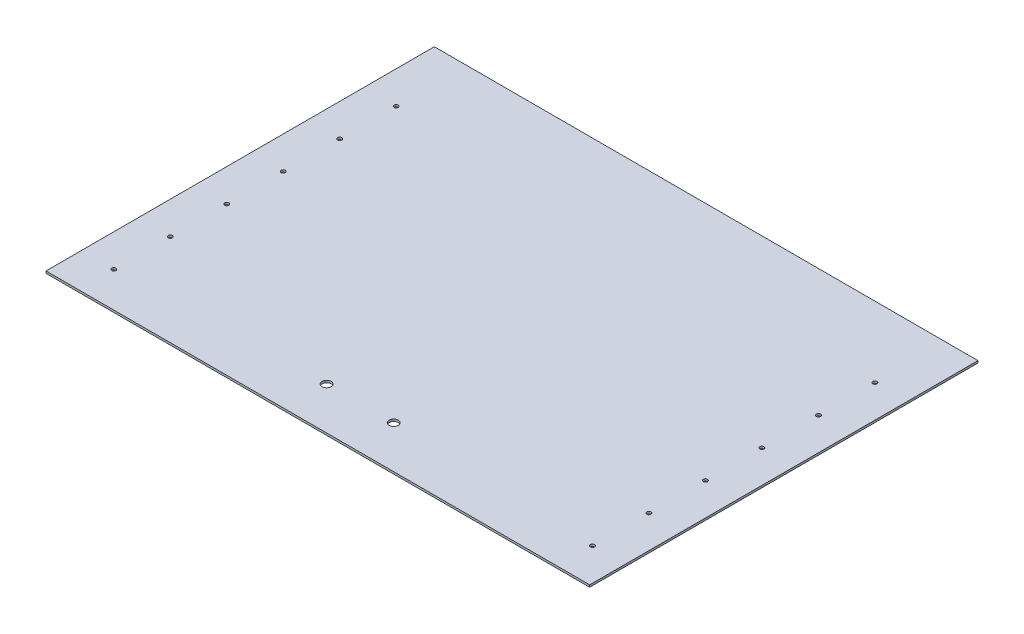
ISO-10303-21;
HEADER;
FILE_DESCRIPTION(('STEP AP214'),'2;1');
FILE_NAME('part.step','',(''),(''),'','','');
FILE_SCHEMA(('AUTOMOTIVE_DESIGN { 1 0 10303 214 1 1 1 1 }'));
ENDSEC;
DATA;
#1=APPLICATION_CONTEXT('core data for automotive mechanical design processes');
#2=APPLICATION_PROTOCOL_DEFINITION('international standard','automotive_design',2000,#1);
#3=PRODUCT_CONTEXT('',#1,'mechanical');
#4=PRODUCT('Part','Part','',(#3));
#5=PRODUCT_RELATED_PRODUCT_CATEGORY('part','',(#4));
#6=PRODUCT_DEFINITION_FORMATION('','',#4);
#7=PRODUCT_DEFINITION_CONTEXT('part definition',#1,'design');
#8=PRODUCT_DEFINITION('design','',#6,#7);
#9=PRODUCT_DEFINITION_SHAPE('','',#8);
#10=(LENGTH_UNIT() NAMED_UNIT(*) SI_UNIT(.MILLI.,.METRE.));
#11=(NAMED_UNIT(*) PLANE_ANGLE_UNIT() SI_UNIT($,.RADIAN.));
#12=(NAMED_UNIT(*) SI_UNIT($,.STERADIAN.) SOLID_ANGLE_UNIT());
#13=UNCERTAINTY_MEASURE_WITH_UNIT(LENGTH_MEASURE(1.E-05),#10,'distance_accuracy_value','');
#14=(GEOMETRIC_REPRESENTATION_CONTEXT(3) GLOBAL_UNCERTAINTY_ASSIGNED_CONTEXT((#13)) GLOBAL_UNIT_ASSIGNED_CONTEXT((#10,
#11,#12)) REPRESENTATION_CONTEXT('',''));
#15=CARTESIAN_POINT('',(0.,0.,0.));
#16=DIRECTION('',(0.,0.,1.));
#17=DIRECTION('',(1.,0.,0.));
#18=AXIS2_PLACEMENT_3D('',#15,#16,#17);
#19=CARTESIAN_POINT('',(385.,-3.,-275.));
#20=DIRECTION('',(1.,0.,0.));
#21=DIRECTION('',(0.,0.,-1.));
#22=AXIS2_PLACEMENT_3D('',#19,#20,#21);
#23=PLANE('',#22);
#24=DIRECTION('',(0.,0.,-1.));
#25=VECTOR('',#24,1.);
#26=CARTESIAN_POINT('',(385.,0.,-275.));
#27=LINE('',#26,#25);
#28=CARTESIAN_POINT('',(385.,0.,275.));
#29=VERTEX_POINT('',#28);
#30=CARTESIAN_POINT('',(385.,0.,-275.));
#31=VERTEX_POINT('',#30);
#32=EDGE_CURVE('E104',#29,#31,#27,.T.);
#33=ORIENTED_EDGE('',*,*,#32,.F.);
#34=DIRECTION('',(0.,1.,0.));
#35=VECTOR('',#34,1.);
#36=CARTESIAN_POINT('',(385.,-3.,275.));
#37=LINE('',#36,#35);
#38=CARTESIAN_POINT('',(385.,-3.,275.));
#39=VERTEX_POINT('',#38);
#40=EDGE_CURVE('E11',#39,#29,#37,.T.);
#41=ORIENTED_EDGE('',*,*,#40,.F.);
#42=DIRECTION('',(0.,0.,-1.));
#43=VECTOR('',#42,1.);
#44=CARTESIAN_POINT('',(385.,-3.,-275.));
#45=LINE('',#44,#43);
#46=CARTESIAN_POINT('',(385.,-3.,-275.));
#47=VERTEX_POINT('',#46);
#48=EDGE_CURVE('E97',#39,#47,#45,.T.);
#49=ORIENTED_EDGE('',*,*,#48,.T.);
#50=DIRECTION('',(0.,1.,0.));
#51=VECTOR('',#50,1.);
#52=CARTESIAN_POINT('',(385.,-3.,-275.));
#53=LINE('',#52,#51);
#54=EDGE_CURVE('E42',#47,#31,#53,.T.);
#55=ORIENTED_EDGE('',*,*,#54,.T.);
#56=EDGE_LOOP('',(#33,#41,#49,#55));
#57=FACE_BOUND('',#56,.T.);
#58=ADVANCED_FACE('F39',(#57),#23,.T.);
#59=CARTESIAN_POINT('',(-385.,-3.,275.));
#60=DIRECTION('',(0.,0.,1.));
#61=DIRECTION('',(1.,0.,0.));
#62=AXIS2_PLACEMENT_3D('',#59,#60,#61);
#63=PLANE('',#62);
#64=DIRECTION('',(1.,0.,0.));
#65=VECTOR('',#64,1.);
#66=CARTESIAN_POINT('',(-385.,0.,275.));
#67=LINE('',#66,#65);
#68=CARTESIAN_POINT('',(-385.,0.,275.));
#69=VERTEX_POINT('',#68);
#70=EDGE_CURVE('E99',#69,#29,#67,.T.);
#71=ORIENTED_EDGE('',*,*,#70,.F.);
#72=DIRECTION('',(0.,1.,0.));
#73=VECTOR('',#72,1.);
#74=CARTESIAN_POINT('',(-385.,-3.,275.));
#75=LINE('',#74,#73);
#76=CARTESIAN_POINT('',(-385.,-3.,275.));
#77=VERTEX_POINT('',#76);
#78=EDGE_CURVE('E48',#77,#69,#75,.T.);
#79=ORIENTED_EDGE('',*,*,#78,.F.);
#80=DIRECTION('',(1.,0.,0.));
#81=VECTOR('',#80,1.);
#82=CARTESIAN_POINT('',(-385.,-3.,275.));
#83=LINE('',#82,#81);
#84=EDGE_CURVE('E94',#77,#39,#83,.T.);
#85=ORIENTED_EDGE('',*,*,#84,.T.);
#86=ORIENTED_EDGE('',*,*,#40,.T.);
#87=EDGE_LOOP('',(#71,#79,#85,#86));
#88=FACE_BOUND('',#87,.T.);
#89=ADVANCED_FACE('F115',(#88),#63,.T.);
#90=CARTESIAN_POINT('',(-385.,-3.,-275.));
#91=DIRECTION('',(-1.,0.,0.));
#92=DIRECTION('',(0.,0.,1.));
#93=AXIS2_PLACEMENT_3D('',#90,#91,#92);
#94=PLANE('',#93);
#95=DIRECTION('',(0.,0.,1.));
#96=VECTOR('',#95,1.);
#97=CARTESIAN_POINT('',(-385.,0.,-275.));
#98=LINE('',#97,#96);
#99=CARTESIAN_POINT('',(-385.,0.,-275.));
#100=VERTEX_POINT('',#99);
#101=EDGE_CURVE('E89',#100,#69,#98,.T.);
#102=ORIENTED_EDGE('',*,*,#101,.F.);
#103=DIRECTION('',(0.,1.,0.));
#104=VECTOR('',#103,1.);
#105=CARTESIAN_POINT('',(-385.,-3.,-275.));
#106=LINE('',#105,#104);
#107=CARTESIAN_POINT('',(-385.,-3.,-275.));
#108=VERTEX_POINT('',#107);
#109=EDGE_CURVE('E84',#108,#100,#106,.T.);
#110=ORIENTED_EDGE('',*,*,#109,.F.);
#111=DIRECTION('',(0.,0.,1.));
#112=VECTOR('',#111,1.);
#113=CARTESIAN_POINT('',(-385.,-3.,-275.));
#114=LINE('',#113,#112);
#115=EDGE_CURVE('E87',#108,#77,#114,.T.);
#116=ORIENTED_EDGE('',*,*,#115,.T.);
#117=ORIENTED_EDGE('',*,*,#78,.T.);
#118=EDGE_LOOP('',(#102,#110,#116,#117));
#119=FACE_BOUND('',#118,.T.);
#120=ADVANCED_FACE('F86',(#119),#94,.T.);
#121=CARTESIAN_POINT('',(-385.,-3.,-275.));
#122=DIRECTION('',(0.,0.,-1.));
#123=DIRECTION('',(-1.,0.,0.));
#124=AXIS2_PLACEMENT_3D('',#121,#122,#123);
#125=PLANE('',#124);
#126=DIRECTION('',(-1.,0.,0.));
#127=VECTOR('',#126,1.);
#128=CARTESIAN_POINT('',(-385.,0.,-275.));
#129=LINE('',#128,#127);
#130=EDGE_CURVE('E107',#31,#100,#129,.T.);
#131=ORIENTED_EDGE('',*,*,#130,.F.);
#132=ORIENTED_EDGE('',*,*,#54,.F.);
#133=DIRECTION('',(-1.,0.,0.));
#134=VECTOR('',#133,1.);
#135=CARTESIAN_POINT('',(-385.,-3.,-275.));
#136=LINE('',#135,#134);
#137=EDGE_CURVE('E93',#47,#108,#136,.T.);
#138=ORIENTED_EDGE('',*,*,#137,.T.);
#139=ORIENTED_EDGE('',*,*,#109,.T.);
#140=EDGE_LOOP('',(#131,#132,#138,#139));
#141=FACE_BOUND('',#140,.T.);
#142=ADVANCED_FACE('F96',(#141),#125,.T.);
#143=CARTESIAN_POINT('',(0.,-3.,0.));
#144=DIRECTION('',(0.,1.,0.));
#145=DIRECTION('',(0.,0.,1.));
#146=AXIS2_PLACEMENT_3D('',#143,#144,#145);
#147=PLANE('',#146);
#148=CARTESIAN_POINT('',(339.,-3.,-175.));
#149=DIRECTION('',(0.,1.,0.));
#150=DIRECTION('',(0.,0.,-1.));
#151=AXIS2_PLACEMENT_3D('',#148,#149,#150);
#152=CIRCLE('',#151,2.99999999999999);
#153=CARTESIAN_POINT('',(339.,-3.,-178.));
#154=VERTEX_POINT('',#153);
#155=EDGE_CURVE('E196',#154,#154,#152,.T.);
#156=ORIENTED_EDGE('',*,*,#155,.T.);
#157=EDGE_LOOP('',(#156));
#158=FACE_BOUND('',#157,.T.);
#159=CARTESIAN_POINT('',(339.,-3.,-95.0000000000002));
#160=DIRECTION('',(0.,1.,0.));
#161=DIRECTION('',(0.,0.,-1.));
#162=AXIS2_PLACEMENT_3D('',#159,#160,#161);
#163=CIRCLE('',#162,2.99999999999999);
#164=CARTESIAN_POINT('',(339.,-3.,-98.0000000000002));
#165=VERTEX_POINT('',#164);
#166=EDGE_CURVE('E204',#165,#165,#163,.T.);
#167=ORIENTED_EDGE('',*,*,#166,.T.);
#168=EDGE_LOOP('',(#167));
#169=FACE_BOUND('',#168,.T.);
#170=CARTESIAN_POINT('',(339.,-3.,-15.0000000000002));
#171=DIRECTION('',(0.,1.,0.));
#172=DIRECTION('',(0.,0.,-1.));
#173=AXIS2_PLACEMENT_3D('',#170,#171,#172);
#174=CIRCLE('',#173,2.99999999999999);
#175=CARTESIAN_POINT('',(339.,-3.,-18.0000000000002));
#176=VERTEX_POINT('',#175);
#177=EDGE_CURVE('E210',#176,#176,#174,.T.);
#178=ORIENTED_EDGE('',*,*,#177,.T.);
#179=EDGE_LOOP('',(#178));
#180=FACE_BOUND('',#179,.T.);
#181=CARTESIAN_POINT('',(339.,-3.,64.9999999999998));
#182=DIRECTION('',(0.,1.,0.));
#183=DIRECTION('',(0.,0.,-1.));
#184=AXIS2_PLACEMENT_3D('',#181,#182,#183);
#185=CIRCLE('',#184,2.99999999999999);
#186=CARTESIAN_POINT('',(339.,-3.,61.9999999999998));
#187=VERTEX_POINT('',#186);
#188=EDGE_CURVE('E216',#187,#187,#185,.T.);
#189=ORIENTED_EDGE('',*,*,#188,.T.);
#190=EDGE_LOOP('',(#189));
#191=FACE_BOUND('',#190,.T.);
#192=CARTESIAN_POINT('',(339.,-3.,145.));
#193=DIRECTION('',(0.,1.,0.));
#194=DIRECTION('',(0.,0.,-1.));
#195=AXIS2_PLACEMENT_3D('',#192,#193,#194);
#196=CIRCLE('',#195,2.99999999999999);
#197=CARTESIAN_POINT('',(339.,-3.,142.));
#198=VERTEX_POINT('',#197);
#199=EDGE_CURVE('E222',#198,#198,#196,.T.);
#200=ORIENTED_EDGE('',*,*,#199,.T.);
#201=EDGE_LOOP('',(#200));
#202=FACE_BOUND('',#201,.T.);
#203=CARTESIAN_POINT('',(339.,-3.,225.));
#204=DIRECTION('',(0.,1.,0.));
#205=DIRECTION('',(0.,0.,-1.));
#206=AXIS2_PLACEMENT_3D('',#203,#204,#205);
#207=CIRCLE('',#206,2.99999999999999);
#208=CARTESIAN_POINT('',(339.,-3.,222.));
#209=VERTEX_POINT('',#208);
#210=EDGE_CURVE('E228',#209,#209,#207,.T.);
#211=ORIENTED_EDGE('',*,*,#210,.T.);
#212=EDGE_LOOP('',(#211));
#213=FACE_BOUND('',#212,.T.);
#214=CARTESIAN_POINT('',(47.5000000000001,-3.,215.));
#215=DIRECTION('',(0.,1.,0.));
#216=DIRECTION('',(0.,0.,-1.));
#217=AXIS2_PLACEMENT_3D('',#214,#215,#216);
#218=CIRCLE('',#217,6.50000000000001);
#219=CARTESIAN_POINT('',(47.5000000000001,-3.,208.5));
#220=VERTEX_POINT('',#219);
#221=EDGE_CURVE('E234',#220,#220,#218,.T.);
#222=ORIENTED_EDGE('',*,*,#221,.T.);
#223=EDGE_LOOP('',(#222));
#224=FACE_BOUND('',#223,.T.);
#225=CARTESIAN_POINT('',(-47.4999999999999,-3.,215.));
#226=DIRECTION('',(0.,1.,0.));
#227=DIRECTION('',(0.,0.,1.));
#228=AXIS2_PLACEMENT_3D('',#225,#226,#227);
#229=CIRCLE('',#228,6.50000000000001);
#230=CARTESIAN_POINT('',(-47.4999999999999,-3.,221.5));
#231=VERTEX_POINT('',#230);
#232=EDGE_CURVE('E240',#231,#231,#229,.T.);
#233=ORIENTED_EDGE('',*,*,#232,.T.);
#234=EDGE_LOOP('',(#233));
#235=FACE_BOUND('',#234,.T.);
#236=CARTESIAN_POINT('',(-339.,-3.,225.));
#237=DIRECTION('',(0.,1.,0.));
#238=DIRECTION('',(0.,0.,1.));
#239=AXIS2_PLACEMENT_3D('',#236,#237,#238);
#240=CIRCLE('',#239,2.99999999999999);
#241=CARTESIAN_POINT('',(-339.,-3.,228.));
#242=VERTEX_POINT('',#241);
#243=EDGE_CURVE('E246',#242,#242,#240,.T.);
#244=ORIENTED_EDGE('',*,*,#243,.T.);
#245=EDGE_LOOP('',(#244));
#246=FACE_BOUND('',#245,.T.);
#247=CARTESIAN_POINT('',(-339.,-3.,145.));
#248=DIRECTION('',(0.,1.,0.));
#249=DIRECTION('',(0.,0.,1.));
#250=AXIS2_PLACEMENT_3D('',#247,#248,#249);
#251=CIRCLE('',#250,2.99999999999999);
#252=CARTESIAN_POINT('',(-339.,-3.,148.));
#253=VERTEX_POINT('',#252);
#254=EDGE_CURVE('E252',#253,#253,#251,.T.);
#255=ORIENTED_EDGE('',*,*,#254,.T.);
#256=EDGE_LOOP('',(#255));
#257=FACE_BOUND('',#256,.T.);
#258=CARTESIAN_POINT('',(-339.,-3.,64.9999999999998));
#259=DIRECTION('',(0.,1.,0.));
#260=DIRECTION('',(0.,0.,1.));
#261=AXIS2_PLACEMENT_3D('',#258,#259,#260);
#262=CIRCLE('',#261,2.99999999999999);
#263=CARTESIAN_POINT('',(-339.,-3.,67.9999999999998));
#264=VERTEX_POINT('',#263);
#265=EDGE_CURVE('E258',#264,#264,#262,.T.);
#266=ORIENTED_EDGE('',*,*,#265,.T.);
#267=EDGE_LOOP('',(#266));
#268=FACE_BOUND('',#267,.T.);
#269=CARTESIAN_POINT('',(-339.,-3.,-15.0000000000002));
#270=DIRECTION('',(0.,1.,0.));
#271=DIRECTION('',(0.,0.,1.));
#272=AXIS2_PLACEMENT_3D('',#269,#270,#271);
#273=CIRCLE('',#272,2.99999999999999);
#274=CARTESIAN_POINT('',(-339.,-3.,-12.0000000000002));
#275=VERTEX_POINT('',#274);
#276=EDGE_CURVE('E264',#275,#275,#273,.T.);
#277=ORIENTED_EDGE('',*,*,#276,.T.);
#278=EDGE_LOOP('',(#277));
#279=FACE_BOUND('',#278,.T.);
#280=CARTESIAN_POINT('',(-339.,-3.,-95.0000000000001));
#281=DIRECTION('',(0.,1.,0.));
#282=DIRECTION('',(0.,0.,1.));
#283=AXIS2_PLACEMENT_3D('',#280,#281,#282);
#284=CIRCLE('',#283,2.99999999999999);
#285=CARTESIAN_POINT('',(-339.,-3.,-92.0000000000002));
#286=VERTEX_POINT('',#285);
#287=EDGE_CURVE('E270',#286,#286,#284,.T.);
#288=ORIENTED_EDGE('',*,*,#287,.T.);
#289=EDGE_LOOP('',(#288));
#290=FACE_BOUND('',#289,.T.);
#291=CARTESIAN_POINT('',(-339.,-3.,-175.));
#292=DIRECTION('',(0.,1.,0.));
#293=DIRECTION('',(0.,0.,1.));
#294=AXIS2_PLACEMENT_3D('',#291,#292,#293);
#295=CIRCLE('',#294,2.99999999999999);
#296=CARTESIAN_POINT('',(-339.,-3.,-172.));
#297=VERTEX_POINT('',#296);
#298=EDGE_CURVE('E108',#297,#297,#295,.T.);
#299=ORIENTED_EDGE('',*,*,#298,.T.);
#300=EDGE_LOOP('',(#299));
#301=FACE_BOUND('',#300,.T.);
#302=ORIENTED_EDGE('',*,*,#48,.F.);
#303=ORIENTED_EDGE('',*,*,#84,.F.);
#304=ORIENTED_EDGE('',*,*,#115,.F.);
#305=ORIENTED_EDGE('',*,*,#137,.F.);
#306=EDGE_LOOP('',(#302,#303,#304,#305));
#307=FACE_BOUND('',#306,.T.);
#308=ADVANCED_FACE('F92',(#158,#169,#180,#191,#202,#213,#224,#235,#246,#257,#268,#279,#290,#301,
#307),#147,.F.);
#309=CARTESIAN_POINT('',(0.,0.,0.));
#310=DIRECTION('',(0.,1.,0.));
#311=DIRECTION('',(0.,0.,1.));
#312=AXIS2_PLACEMENT_3D('',#309,#310,#311);
#313=PLANE('',#312);
#314=CARTESIAN_POINT('',(339.,0.,-175.));
#315=DIRECTION('',(0.,1.,0.));
#316=DIRECTION('',(0.,0.,-1.));
#317=AXIS2_PLACEMENT_3D('',#314,#315,#316);
#318=CIRCLE('',#317,2.99999999999999);
#319=CARTESIAN_POINT('',(339.,0.,-178.));
#320=VERTEX_POINT('',#319);
#321=EDGE_CURVE('E199',#320,#320,#318,.T.);
#322=ORIENTED_EDGE('',*,*,#321,.F.);
#323=EDGE_LOOP('',(#322));
#324=FACE_BOUND('',#323,.T.);
#325=CARTESIAN_POINT('',(339.,0.,-95.0000000000002));
#326=DIRECTION('',(0.,1.,0.));
#327=DIRECTION('',(0.,0.,-1.));
#328=AXIS2_PLACEMENT_3D('',#325,#326,#327);
#329=CIRCLE('',#328,2.99999999999999);
#330=CARTESIAN_POINT('',(339.,0.,-98.0000000000002));
#331=VERTEX_POINT('',#330);
#332=EDGE_CURVE('E201',#331,#331,#329,.T.);
#333=ORIENTED_EDGE('',*,*,#332,.F.);
#334=EDGE_LOOP('',(#333));
#335=FACE_BOUND('',#334,.T.);
#336=CARTESIAN_POINT('',(339.,0.,-15.0000000000002));
#337=DIRECTION('',(0.,1.,0.));
#338=DIRECTION('',(0.,0.,-1.));
#339=AXIS2_PLACEMENT_3D('',#336,#337,#338);
#340=CIRCLE('',#339,2.99999999999999);
#341=CARTESIAN_POINT('',(339.,0.,-18.0000000000002));
#342=VERTEX_POINT('',#341);
#343=EDGE_CURVE('E207',#342,#342,#340,.T.);
#344=ORIENTED_EDGE('',*,*,#343,.F.);
#345=EDGE_LOOP('',(#344));
#346=FACE_BOUND('',#345,.T.);
#347=CARTESIAN_POINT('',(339.,0.,64.9999999999998));
#348=DIRECTION('',(0.,1.,0.));
#349=DIRECTION('',(0.,0.,-1.));
#350=AXIS2_PLACEMENT_3D('',#347,#348,#349);
#351=CIRCLE('',#350,2.99999999999999);
#352=CARTESIAN_POINT('',(339.,0.,61.9999999999998));
#353=VERTEX_POINT('',#352);
#354=EDGE_CURVE('E213',#353,#353,#351,.T.);
#355=ORIENTED_EDGE('',*,*,#354,.F.);
#356=EDGE_LOOP('',(#355));
#357=FACE_BOUND('',#356,.T.);
#358=CARTESIAN_POINT('',(339.,0.,145.));
#359=DIRECTION('',(0.,1.,0.));
#360=DIRECTION('',(0.,0.,-1.));
#361=AXIS2_PLACEMENT_3D('',#358,#359,#360);
#362=CIRCLE('',#361,2.99999999999999);
#363=CARTESIAN_POINT('',(339.,0.,142.));
#364=VERTEX_POINT('',#363);
#365=EDGE_CURVE('E219',#364,#364,#362,.T.);
#366=ORIENTED_EDGE('',*,*,#365,.F.);
#367=EDGE_LOOP('',(#366));
#368=FACE_BOUND('',#367,.T.);
#369=CARTESIAN_POINT('',(339.,0.,225.));
#370=DIRECTION('',(0.,1.,0.));
#371=DIRECTION('',(0.,0.,-1.));
#372=AXIS2_PLACEMENT_3D('',#369,#370,#371);
#373=CIRCLE('',#372,2.99999999999999);
#374=CARTESIAN_POINT('',(339.,0.,222.));
#375=VERTEX_POINT('',#374);
#376=EDGE_CURVE('E225',#375,#375,#373,.T.);
#377=ORIENTED_EDGE('',*,*,#376,.F.);
#378=EDGE_LOOP('',(#377));
#379=FACE_BOUND('',#378,.T.);
#380=CARTESIAN_POINT('',(47.5000000000001,0.,215.));
#381=DIRECTION('',(0.,1.,0.));
#382=DIRECTION('',(0.,0.,-1.));
#383=AXIS2_PLACEMENT_3D('',#380,#381,#382);
#384=CIRCLE('',#383,6.50000000000001);
#385=CARTESIAN_POINT('',(47.5000000000001,0.,208.5));
#386=VERTEX_POINT('',#385);
#387=EDGE_CURVE('E231',#386,#386,#384,.T.);
#388=ORIENTED_EDGE('',*,*,#387,.F.);
#389=EDGE_LOOP('',(#388));
#390=FACE_BOUND('',#389,.T.);
#391=CARTESIAN_POINT('',(-47.4999999999999,0.,215.));
#392=DIRECTION('',(0.,1.,0.));
#393=DIRECTION('',(0.,0.,1.));
#394=AXIS2_PLACEMENT_3D('',#391,#392,#393);
#395=CIRCLE('',#394,6.50000000000001);
#396=CARTESIAN_POINT('',(-47.4999999999999,0.,221.5));
#397=VERTEX_POINT('',#396);
#398=EDGE_CURVE('E237',#397,#397,#395,.T.);
#399=ORIENTED_EDGE('',*,*,#398,.F.);
#400=EDGE_LOOP('',(#399));
#401=FACE_BOUND('',#400,.T.);
#402=CARTESIAN_POINT('',(-339.,0.,225.));
#403=DIRECTION('',(0.,1.,0.));
#404=DIRECTION('',(0.,0.,1.));
#405=AXIS2_PLACEMENT_3D('',#402,#403,#404);
#406=CIRCLE('',#405,2.99999999999999);
#407=CARTESIAN_POINT('',(-339.,0.,228.));
#408=VERTEX_POINT('',#407);
#409=EDGE_CURVE('E243',#408,#408,#406,.T.);
#410=ORIENTED_EDGE('',*,*,#409,.F.);
#411=EDGE_LOOP('',(#410));
#412=FACE_BOUND('',#411,.T.);
#413=CARTESIAN_POINT('',(-339.,0.,145.));
#414=DIRECTION('',(0.,1.,0.));
#415=DIRECTION('',(0.,0.,1.));
#416=AXIS2_PLACEMENT_3D('',#413,#414,#415);
#417=CIRCLE('',#416,2.99999999999999);
#418=CARTESIAN_POINT('',(-339.,0.,148.));
#419=VERTEX_POINT('',#418);
#420=EDGE_CURVE('E249',#419,#419,#417,.T.);
#421=ORIENTED_EDGE('',*,*,#420,.F.);
#422=EDGE_LOOP('',(#421));
#423=FACE_BOUND('',#422,.T.);
#424=CARTESIAN_POINT('',(-339.,0.,64.9999999999998));
#425=DIRECTION('',(0.,1.,0.));
#426=DIRECTION('',(0.,0.,1.));
#427=AXIS2_PLACEMENT_3D('',#424,#425,#426);
#428=CIRCLE('',#427,2.99999999999999);
#429=CARTESIAN_POINT('',(-339.,0.,67.9999999999998));
#430=VERTEX_POINT('',#429);
#431=EDGE_CURVE('E255',#430,#430,#428,.T.);
#432=ORIENTED_EDGE('',*,*,#431,.F.);
#433=EDGE_LOOP('',(#432));
#434=FACE_BOUND('',#433,.T.);
#435=CARTESIAN_POINT('',(-339.,0.,-15.0000000000002));
#436=DIRECTION('',(0.,1.,0.));
#437=DIRECTION('',(0.,0.,1.));
#438=AXIS2_PLACEMENT_3D('',#435,#436,#437);
#439=CIRCLE('',#438,2.99999999999999);
#440=CARTESIAN_POINT('',(-339.,0.,-12.0000000000002));
#441=VERTEX_POINT('',#440);
#442=EDGE_CURVE('E261',#441,#441,#439,.T.);
#443=ORIENTED_EDGE('',*,*,#442,.F.);
#444=EDGE_LOOP('',(#443));
#445=FACE_BOUND('',#444,.T.);
#446=CARTESIAN_POINT('',(-339.,0.,-95.0000000000001));
#447=DIRECTION('',(0.,1.,0.));
#448=DIRECTION('',(0.,0.,1.));
#449=AXIS2_PLACEMENT_3D('',#446,#447,#448);
#450=CIRCLE('',#449,2.99999999999999);
#451=CARTESIAN_POINT('',(-339.,0.,-92.0000000000002));
#452=VERTEX_POINT('',#451);
#453=EDGE_CURVE('E267',#452,#452,#450,.T.);
#454=ORIENTED_EDGE('',*,*,#453,.F.);
#455=EDGE_LOOP('',(#454));
#456=FACE_BOUND('',#455,.T.);
#457=CARTESIAN_POINT('',(-339.,0.,-175.));
#458=DIRECTION('',(0.,1.,0.));
#459=DIRECTION('',(0.,0.,1.));
#460=AXIS2_PLACEMENT_3D('',#457,#458,#459);
#461=CIRCLE('',#460,2.99999999999999);
#462=CARTESIAN_POINT('',(-339.,0.,-172.));
#463=VERTEX_POINT('',#462);
#464=EDGE_CURVE('E273',#463,#463,#461,.T.);
#465=ORIENTED_EDGE('',*,*,#464,.F.);
#466=EDGE_LOOP('',(#465));
#467=FACE_BOUND('',#466,.T.);
#468=ORIENTED_EDGE('',*,*,#32,.T.);
#469=ORIENTED_EDGE('',*,*,#130,.T.);
#470=ORIENTED_EDGE('',*,*,#101,.T.);
#471=ORIENTED_EDGE('',*,*,#70,.T.);
#472=EDGE_LOOP('',(#468,#469,#470,#471));
#473=FACE_BOUND('',#472,.T.);
#474=ADVANCED_FACE('F114',(#324,#335,#346,#357,#368,#379,#390,#401,#412,#423,#434,#445,#456,
#467,#473),#313,.T.);
#475=CARTESIAN_POINT('',(-339.,-3.,-175.));
#476=DIRECTION('',(0.,1.,0.));
#477=DIRECTION('',(0.,0.,1.));
#478=AXIS2_PLACEMENT_3D('',#475,#476,#477);
#479=CYLINDRICAL_SURFACE('',#478,2.99999999999999);
#480=ORIENTED_EDGE('',*,*,#298,.F.);
#481=EDGE_LOOP('',(#480));
#482=FACE_BOUND('',#481,.T.);
#483=ORIENTED_EDGE('',*,*,#464,.T.);
#484=EDGE_LOOP('',(#483));
#485=FACE_BOUND('',#484,.T.);
#486=ADVANCED_FACE('F133',(#482,#485),#479,.F.);
#487=CARTESIAN_POINT('',(-339.,-3.,-95.0000000000001));
#488=DIRECTION('',(0.,1.,0.));
#489=DIRECTION('',(0.,0.,1.));
#490=AXIS2_PLACEMENT_3D('',#487,#488,#489);
#491=CYLINDRICAL_SURFACE('',#490,2.99999999999999);
#492=ORIENTED_EDGE('',*,*,#287,.F.);
#493=EDGE_LOOP('',(#492));
#494=FACE_BOUND('',#493,.T.);
#495=ORIENTED_EDGE('',*,*,#453,.T.);
#496=EDGE_LOOP('',(#495));
#497=FACE_BOUND('',#496,.T.);
#498=ADVANCED_FACE('F140',(#494,#497),#491,.F.);
#499=CARTESIAN_POINT('',(-339.,-3.,-15.0000000000002));
#500=DIRECTION('',(0.,1.,0.));
#501=DIRECTION('',(0.,0.,1.));
#502=AXIS2_PLACEMENT_3D('',#499,#500,#501);
#503=CYLINDRICAL_SURFACE('',#502,2.99999999999999);
#504=ORIENTED_EDGE('',*,*,#276,.F.);
#505=EDGE_LOOP('',(#504));
#506=FACE_BOUND('',#505,.T.);
#507=ORIENTED_EDGE('',*,*,#442,.T.);
#508=EDGE_LOOP('',(#507));
#509=FACE_BOUND('',#508,.T.);
#510=ADVANCED_FACE('F144',(#506,#509),#503,.F.);
#511=CARTESIAN_POINT('',(-339.,-3.,64.9999999999998));
#512=DIRECTION('',(0.,1.,0.));
#513=DIRECTION('',(0.,0.,1.));
#514=AXIS2_PLACEMENT_3D('',#511,#512,#513);
#515=CYLINDRICAL_SURFACE('',#514,2.99999999999999);
#516=ORIENTED_EDGE('',*,*,#265,.F.);
#517=EDGE_LOOP('',(#516));
#518=FACE_BOUND('',#517,.T.);
#519=ORIENTED_EDGE('',*,*,#431,.T.);
#520=EDGE_LOOP('',(#519));
#521=FACE_BOUND('',#520,.T.);
#522=ADVANCED_FACE('F148',(#518,#521),#515,.F.);
#523=CARTESIAN_POINT('',(-339.,-3.,145.));
#524=DIRECTION('',(0.,1.,0.));
#525=DIRECTION('',(0.,0.,1.));
#526=AXIS2_PLACEMENT_3D('',#523,#524,#525);
#527=CYLINDRICAL_SURFACE('',#526,2.99999999999999);
#528=ORIENTED_EDGE('',*,*,#254,.F.);
#529=EDGE_LOOP('',(#528));
#530=FACE_BOUND('',#529,.T.);
#531=ORIENTED_EDGE('',*,*,#420,.T.);
#532=EDGE_LOOP('',(#531));
#533=FACE_BOUND('',#532,.T.);
#534=ADVANCED_FACE('F152',(#530,#533),#527,.F.);
#535=CARTESIAN_POINT('',(-339.,-3.,225.));
#536=DIRECTION('',(0.,1.,0.));
#537=DIRECTION('',(0.,0.,1.));
#538=AXIS2_PLACEMENT_3D('',#535,#536,#537);
#539=CYLINDRICAL_SURFACE('',#538,2.99999999999999);
#540=ORIENTED_EDGE('',*,*,#243,.F.);
#541=EDGE_LOOP('',(#540));
#542=FACE_BOUND('',#541,.T.);
#543=ORIENTED_EDGE('',*,*,#409,.T.);
#544=EDGE_LOOP('',(#543));
#545=FACE_BOUND('',#544,.T.);
#546=ADVANCED_FACE('F156',(#542,#545),#539,.F.);
#547=CARTESIAN_POINT('',(-47.4999999999999,-3.,215.));
#548=DIRECTION('',(0.,1.,0.));
#549=DIRECTION('',(0.,0.,1.));
#550=AXIS2_PLACEMENT_3D('',#547,#548,#549);
#551=CYLINDRICAL_SURFACE('',#550,6.50000000000001);
#552=ORIENTED_EDGE('',*,*,#232,.F.);
#553=EDGE_LOOP('',(#552));
#554=FACE_BOUND('',#553,.T.);
#555=ORIENTED_EDGE('',*,*,#398,.T.);
#556=EDGE_LOOP('',(#555));
#557=FACE_BOUND('',#556,.T.);
#558=ADVANCED_FACE('F160',(#554,#557),#551,.F.);
#559=CARTESIAN_POINT('',(47.5000000000001,-3.,215.));
#560=DIRECTION('',(0.,1.,0.));
#561=DIRECTION('',(0.,0.,1.));
#562=AXIS2_PLACEMENT_3D('',#559,#560,#561);
#563=CYLINDRICAL_SURFACE('',#562,6.50000000000001);
#564=ORIENTED_EDGE('',*,*,#221,.F.);
#565=EDGE_LOOP('',(#564));
#566=FACE_BOUND('',#565,.T.);
#567=ORIENTED_EDGE('',*,*,#387,.T.);
#568=EDGE_LOOP('',(#567));
#569=FACE_BOUND('',#568,.T.);
#570=ADVANCED_FACE('F164',(#566,#569),#563,.F.);
#571=CARTESIAN_POINT('',(339.,-3.,225.));
#572=DIRECTION('',(0.,1.,0.));
#573=DIRECTION('',(0.,0.,1.));
#574=AXIS2_PLACEMENT_3D('',#571,#572,#573);
#575=CYLINDRICAL_SURFACE('',#574,2.99999999999999);
#576=ORIENTED_EDGE('',*,*,#210,.F.);
#577=EDGE_LOOP('',(#576));
#578=FACE_BOUND('',#577,.T.);
#579=ORIENTED_EDGE('',*,*,#376,.T.);
#580=EDGE_LOOP('',(#579));
#581=FACE_BOUND('',#580,.T.);
#582=ADVANCED_FACE('F168',(#578,#581),#575,.F.);
#583=CARTESIAN_POINT('',(339.,-3.,145.));
#584=DIRECTION('',(0.,1.,0.));
#585=DIRECTION('',(0.,0.,1.));
#586=AXIS2_PLACEMENT_3D('',#583,#584,#585);
#587=CYLINDRICAL_SURFACE('',#586,2.99999999999999);
#588=ORIENTED_EDGE('',*,*,#199,.F.);
#589=EDGE_LOOP('',(#588));
#590=FACE_BOUND('',#589,.T.);
#591=ORIENTED_EDGE('',*,*,#365,.T.);
#592=EDGE_LOOP('',(#591));
#593=FACE_BOUND('',#592,.T.);
#594=ADVANCED_FACE('F172',(#590,#593),#587,.F.);
#595=CARTESIAN_POINT('',(339.,-3.,64.9999999999998));
#596=DIRECTION('',(0.,1.,0.));
#597=DIRECTION('',(0.,0.,1.));
#598=AXIS2_PLACEMENT_3D('',#595,#596,#597);
#599=CYLINDRICAL_SURFACE('',#598,2.99999999999999);
#600=ORIENTED_EDGE('',*,*,#188,.F.);
#601=EDGE_LOOP('',(#600));
#602=FACE_BOUND('',#601,.T.);
#603=ORIENTED_EDGE('',*,*,#354,.T.);
#604=EDGE_LOOP('',(#603));
#605=FACE_BOUND('',#604,.T.);
#606=ADVANCED_FACE('F176',(#602,#605),#599,.F.);
#607=CARTESIAN_POINT('',(339.,-3.,-15.0000000000002));
#608=DIRECTION('',(0.,1.,0.));
#609=DIRECTION('',(0.,0.,1.));
#610=AXIS2_PLACEMENT_3D('',#607,#608,#609);
#611=CYLINDRICAL_SURFACE('',#610,2.99999999999999);
#612=ORIENTED_EDGE('',*,*,#177,.F.);
#613=EDGE_LOOP('',(#612));
#614=FACE_BOUND('',#613,.T.);
#615=ORIENTED_EDGE('',*,*,#343,.T.);
#616=EDGE_LOOP('',(#615));
#617=FACE_BOUND('',#616,.T.);
#618=ADVANCED_FACE('F180',(#614,#617),#611,.F.);
#619=CARTESIAN_POINT('',(339.,-3.,-95.0000000000002));
#620=DIRECTION('',(0.,1.,0.));
#621=DIRECTION('',(0.,0.,1.));
#622=AXIS2_PLACEMENT_3D('',#619,#620,#621);
#623=CYLINDRICAL_SURFACE('',#622,2.99999999999999);
#624=ORIENTED_EDGE('',*,*,#166,.F.);
#625=EDGE_LOOP('',(#624));
#626=FACE_BOUND('',#625,.T.);
#627=ORIENTED_EDGE('',*,*,#332,.T.);
#628=EDGE_LOOP('',(#627));
#629=FACE_BOUND('',#628,.T.);
#630=ADVANCED_FACE('F184',(#626,#629),#623,.F.);
#631=CARTESIAN_POINT('',(339.,-3.,-175.));
#632=DIRECTION('',(0.,1.,0.));
#633=DIRECTION('',(0.,0.,1.));
#634=AXIS2_PLACEMENT_3D('',#631,#632,#633);
#635=CYLINDRICAL_SURFACE('',#634,2.99999999999999);
#636=ORIENTED_EDGE('',*,*,#155,.F.);
#637=EDGE_LOOP('',(#636));
#638=FACE_BOUND('',#637,.T.);
#639=ORIENTED_EDGE('',*,*,#321,.T.);
#640=EDGE_LOOP('',(#639));
#641=FACE_BOUND('',#640,.T.);
#642=ADVANCED_FACE('F188',(#638,#641),#635,.F.);
#643=CLOSED_SHELL('',(#58,#89,#120,#142,#308,#474,#486,#498,#510,#522,#534,#546,#558,#570,#582,
#594,#606,#618,#630,#642));
#644=MANIFOLD_SOLID_BREP('B2',#643);
#645=ADVANCED_BREP_SHAPE_REPRESENTATION('',(#18,#644),#14);
#646=SHAPE_DEFINITION_REPRESENTATION(#9,#645);
ENDSEC;
END-ISO-10303-21;
